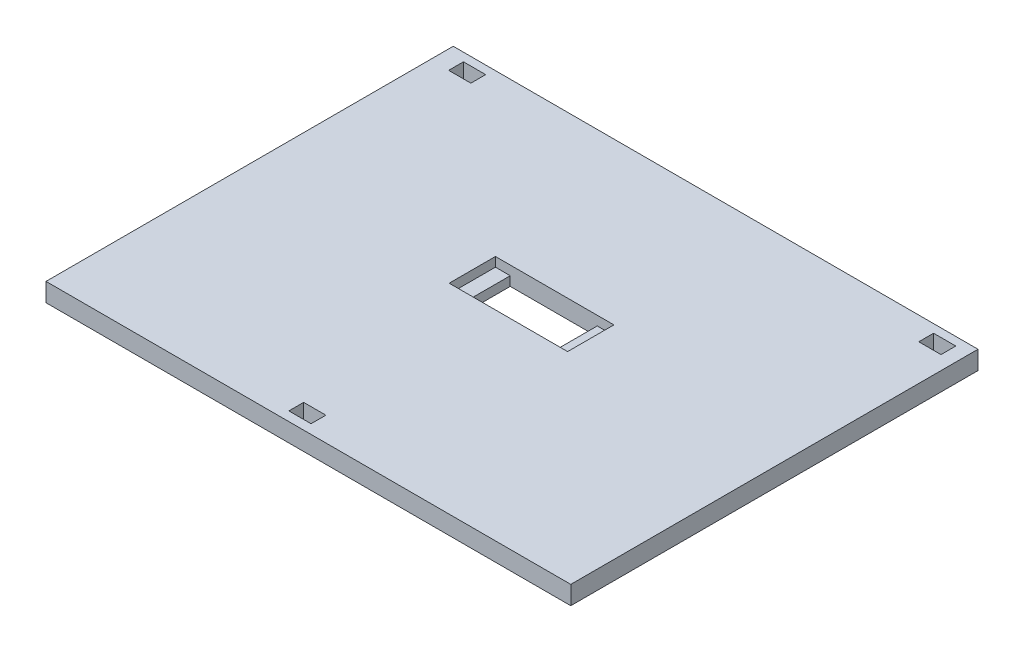
ISO-10303-21;
HEADER;
FILE_DESCRIPTION(('STEP AP214'),'2;1');
FILE_NAME('part.step','',(''),(''),'','','');
FILE_SCHEMA(('AUTOMOTIVE_DESIGN { 1 0 10303 214 1 1 1 1 }'));
ENDSEC;
DATA;
#1=APPLICATION_CONTEXT('core data for automotive mechanical design processes');
#2=APPLICATION_PROTOCOL_DEFINITION('international standard','automotive_design',2000,#1);
#3=PRODUCT_CONTEXT('',#1,'mechanical');
#4=PRODUCT('Part','Part','',(#3));
#5=PRODUCT_RELATED_PRODUCT_CATEGORY('part','',(#4));
#6=PRODUCT_DEFINITION_FORMATION('','',#4);
#7=PRODUCT_DEFINITION_CONTEXT('part definition',#1,'design');
#8=PRODUCT_DEFINITION('design','',#6,#7);
#9=PRODUCT_DEFINITION_SHAPE('','',#8);
#10=(LENGTH_UNIT() NAMED_UNIT(*) SI_UNIT(.MILLI.,.METRE.));
#11=(NAMED_UNIT(*) PLANE_ANGLE_UNIT() SI_UNIT($,.RADIAN.));
#12=(NAMED_UNIT(*) SI_UNIT($,.STERADIAN.) SOLID_ANGLE_UNIT());
#13=UNCERTAINTY_MEASURE_WITH_UNIT(LENGTH_MEASURE(1.E-05),#10,'distance_accuracy_value','');
#14=(GEOMETRIC_REPRESENTATION_CONTEXT(3) GLOBAL_UNCERTAINTY_ASSIGNED_CONTEXT((#13)) GLOBAL_UNIT_ASSIGNED_CONTEXT((#10,
#11,#12)) REPRESENTATION_CONTEXT('',''));
#15=CARTESIAN_POINT('',(0.,0.,0.));
#16=DIRECTION('',(0.,0.,1.));
#17=DIRECTION('',(1.,0.,0.));
#18=AXIS2_PLACEMENT_3D('',#15,#16,#17);
#19=CARTESIAN_POINT('',(0.,2.54,0.));
#20=DIRECTION('',(0.,1.,0.));
#21=DIRECTION('',(0.,0.,1.));
#22=AXIS2_PLACEMENT_3D('',#19,#20,#21);
#23=PLANE('',#22);
#24=DIRECTION('',(0.,0.,1.));
#25=VECTOR('',#24,1.);
#26=CARTESIAN_POINT('',(-22.8669688569918,2.54,8.40055247577288));
#27=LINE('',#26,#25);
#28=CARTESIAN_POINT('',(-22.8669688569918,2.54,8.40055247577288));
#29=VERTEX_POINT('',#28);
#30=CARTESIAN_POINT('',(-22.8669688569918,2.54,21.1005524757729));
#31=VERTEX_POINT('',#30);
#32=EDGE_CURVE('E213',#29,#31,#27,.T.);
#33=ORIENTED_EDGE('',*,*,#32,.F.);
#34=DIRECTION('',(-1.,0.,0.));
#35=VECTOR('',#34,1.);
#36=CARTESIAN_POINT('',(-26.9309688569918,2.54,8.40055247577288));
#37=LINE('',#36,#35);
#38=CARTESIAN_POINT('',(-26.9309688569918,2.54,8.40055247577288));
#39=VERTEX_POINT('',#38);
#40=EDGE_CURVE('E265',#29,#39,#37,.T.);
#41=ORIENTED_EDGE('',*,*,#40,.T.);
#42=DIRECTION('',(0.,0.,1.));
#43=VECTOR('',#42,1.);
#44=CARTESIAN_POINT('',(-26.9309688569918,2.54,8.40055247577288));
#45=LINE('',#44,#43);
#46=CARTESIAN_POINT('',(-26.9309688569918,2.54,21.1005524757729));
#47=VERTEX_POINT('',#46);
#48=EDGE_CURVE('E252',#39,#47,#45,.T.);
#49=ORIENTED_EDGE('',*,*,#48,.T.);
#50=DIRECTION('',(1.,0.,0.));
#51=VECTOR('',#50,1.);
#52=CARTESIAN_POINT('',(-26.9309688569918,2.54,21.1005524757729));
#53=LINE('',#52,#51);
#54=EDGE_CURVE('E258',#47,#31,#53,.T.);
#55=ORIENTED_EDGE('',*,*,#54,.T.);
#56=EDGE_LOOP('',(#33,#41,#49,#55));
#57=FACE_BOUND('',#56,.T.);
#58=ADVANCED_FACE('F45',(#57),#23,.T.);
#59=CARTESIAN_POINT('',(-82.6839688569918,5.08,-35.7689444314931));
#60=DIRECTION('',(1.,0.,0.));
#61=DIRECTION('',(0.,0.,-1.));
#62=AXIS2_PLACEMENT_3D('',#59,#60,#61);
#63=PLANE('',#62);
#64=DIRECTION('',(0.,0.,1.));
#65=VECTOR('',#64,1.);
#66=CARTESIAN_POINT('',(-82.6839688569918,0.,-35.7689444314931));
#67=LINE('',#66,#65);
#68=CARTESIAN_POINT('',(-82.6839688569918,0.,-35.7689444314931));
#69=VERTEX_POINT('',#68);
#70=CARTESIAN_POINT('',(-82.6839688569918,0.,75.9910555685069));
#71=VERTEX_POINT('',#70);
#72=EDGE_CURVE('E332',#69,#71,#67,.T.);
#73=ORIENTED_EDGE('',*,*,#72,.T.);
#74=DIRECTION('',(0.,-1.,0.));
#75=VECTOR('',#74,1.);
#76=CARTESIAN_POINT('',(-82.6839688569918,5.08,75.9910555685069));
#77=LINE('',#76,#75);
#78=CARTESIAN_POINT('',(-82.6839688569918,5.08,75.9910555685069));
#79=VERTEX_POINT('',#78);
#80=EDGE_CURVE('E11',#79,#71,#77,.T.);
#81=ORIENTED_EDGE('',*,*,#80,.F.);
#82=DIRECTION('',(0.,0.,1.));
#83=VECTOR('',#82,1.);
#84=CARTESIAN_POINT('',(-82.6839688569918,5.08,-35.7689444314931));
#85=LINE('',#84,#83);
#86=CARTESIAN_POINT('',(-82.6839688569918,5.08,-35.7689444314931));
#87=VERTEX_POINT('',#86);
#88=EDGE_CURVE('E428',#87,#79,#85,.T.);
#89=ORIENTED_EDGE('',*,*,#88,.F.);
#90=DIRECTION('',(0.,-1.,0.));
#91=VECTOR('',#90,1.);
#92=CARTESIAN_POINT('',(-82.6839688569918,5.08,-35.7689444314931));
#93=LINE('',#92,#91);
#94=EDGE_CURVE('E442',#87,#69,#93,.T.);
#95=ORIENTED_EDGE('',*,*,#94,.T.);
#96=EDGE_LOOP('',(#73,#81,#89,#95));
#97=FACE_BOUND('',#96,.T.);
#98=ADVANCED_FACE('F47',(#97),#63,.F.);
#99=CARTESIAN_POINT('',(-82.6839688569918,5.08,75.9910555685069));
#100=DIRECTION('',(0.,0.,-1.));
#101=DIRECTION('',(-1.,0.,0.));
#102=AXIS2_PLACEMENT_3D('',#99,#100,#101);
#103=PLANE('',#102);
#104=DIRECTION('',(1.,0.,0.));
#105=VECTOR('',#104,1.);
#106=CARTESIAN_POINT('',(-82.6839688569918,0.,75.9910555685069));
#107=LINE('',#106,#105);
#108=CARTESIAN_POINT('',(61.3340311430082,0.,75.9910555685069));
#109=VERTEX_POINT('',#108);
#110=EDGE_CURVE('E446',#71,#109,#107,.T.);
#111=ORIENTED_EDGE('',*,*,#110,.T.);
#112=DIRECTION('',(0.,-1.,0.));
#113=VECTOR('',#112,1.);
#114=CARTESIAN_POINT('',(61.3340311430082,5.08,75.9910555685069));
#115=LINE('',#114,#113);
#116=CARTESIAN_POINT('',(61.3340311430082,5.08,75.9910555685069));
#117=VERTEX_POINT('',#116);
#118=EDGE_CURVE('E54',#117,#109,#115,.T.);
#119=ORIENTED_EDGE('',*,*,#118,.F.);
#120=DIRECTION('',(1.,0.,0.));
#121=VECTOR('',#120,1.);
#122=CARTESIAN_POINT('',(-82.6839688569918,5.08,75.9910555685069));
#123=LINE('',#122,#121);
#124=EDGE_CURVE('E432',#79,#117,#123,.T.);
#125=ORIENTED_EDGE('',*,*,#124,.F.);
#126=ORIENTED_EDGE('',*,*,#80,.T.);
#127=EDGE_LOOP('',(#111,#119,#125,#126));
#128=FACE_BOUND('',#127,.T.);
#129=ADVANCED_FACE('F481',(#128),#103,.F.);
#130=CARTESIAN_POINT('',(61.3340311430082,5.08,-35.7689444314931));
#131=DIRECTION('',(-1.,0.,0.));
#132=DIRECTION('',(0.,0.,1.));
#133=AXIS2_PLACEMENT_3D('',#130,#131,#132);
#134=PLANE('',#133);
#135=DIRECTION('',(0.,0.,-1.));
#136=VECTOR('',#135,1.);
#137=CARTESIAN_POINT('',(61.3340311430082,0.,-35.7689444314931));
#138=LINE('',#137,#136);
#139=CARTESIAN_POINT('',(61.3340311430082,0.,-35.7689444314931));
#140=VERTEX_POINT('',#139);
#141=EDGE_CURVE('E449',#109,#140,#138,.T.);
#142=ORIENTED_EDGE('',*,*,#141,.T.);
#143=DIRECTION('',(0.,-1.,0.));
#144=VECTOR('',#143,1.);
#145=CARTESIAN_POINT('',(61.3340311430082,5.08,-35.7689444314931));
#146=LINE('',#145,#144);
#147=CARTESIAN_POINT('',(61.3340311430082,5.08,-35.7689444314931));
#148=VERTEX_POINT('',#147);
#149=EDGE_CURVE('E457',#148,#140,#146,.T.);
#150=ORIENTED_EDGE('',*,*,#149,.F.);
#151=DIRECTION('',(0.,0.,-1.));
#152=VECTOR('',#151,1.);
#153=CARTESIAN_POINT('',(61.3340311430082,5.08,-35.7689444314931));
#154=LINE('',#153,#152);
#155=EDGE_CURVE('E436',#117,#148,#154,.T.);
#156=ORIENTED_EDGE('',*,*,#155,.F.);
#157=ORIENTED_EDGE('',*,*,#118,.T.);
#158=EDGE_LOOP('',(#142,#150,#156,#157));
#159=FACE_BOUND('',#158,.T.);
#160=ADVANCED_FACE('F466',(#159),#134,.F.);
#161=CARTESIAN_POINT('',(-82.6839688569918,5.08,-35.7689444314931));
#162=DIRECTION('',(0.,0.,1.));
#163=DIRECTION('',(1.,0.,0.));
#164=AXIS2_PLACEMENT_3D('',#161,#162,#163);
#165=PLANE('',#164);
#166=DIRECTION('',(-1.,0.,0.));
#167=VECTOR('',#166,1.);
#168=CARTESIAN_POINT('',(-82.6839688569918,0.,-35.7689444314931));
#169=LINE('',#168,#167);
#170=EDGE_CURVE('E433',#140,#69,#169,.T.);
#171=ORIENTED_EDGE('',*,*,#170,.T.);
#172=ORIENTED_EDGE('',*,*,#94,.F.);
#173=DIRECTION('',(-1.,0.,0.));
#174=VECTOR('',#173,1.);
#175=CARTESIAN_POINT('',(-82.6839688569918,5.08,-35.7689444314931));
#176=LINE('',#175,#174);
#177=EDGE_CURVE('E439',#148,#87,#176,.T.);
#178=ORIENTED_EDGE('',*,*,#177,.F.);
#179=ORIENTED_EDGE('',*,*,#149,.T.);
#180=EDGE_LOOP('',(#171,#172,#178,#179));
#181=FACE_BOUND('',#180,.T.);
#182=ADVANCED_FACE('F474',(#181),#165,.F.);
#183=CARTESIAN_POINT('',(0.,5.08,0.));
#184=DIRECTION('',(0.,1.,0.));
#185=DIRECTION('',(0.,0.,1.));
#186=AXIS2_PLACEMENT_3D('',#183,#184,#185);
#187=PLANE('',#186);
#188=DIRECTION('',(0.,0.,1.));
#189=VECTOR('',#188,1.);
#190=CARTESIAN_POINT('',(-26.9309688569918,5.08,8.40055247577288));
#191=LINE('',#190,#189);
#192=CARTESIAN_POINT('',(-26.9309688569918,5.08,8.40055247577288));
#193=VERTEX_POINT('',#192);
#194=CARTESIAN_POINT('',(-26.9309688569918,5.08,21.1005524757729));
#195=VERTEX_POINT('',#194);
#196=EDGE_CURVE('E246',#193,#195,#191,.T.);
#197=ORIENTED_EDGE('',*,*,#196,.F.);
#198=DIRECTION('',(-1.,0.,0.));
#199=VECTOR('',#198,1.);
#200=CARTESIAN_POINT('',(-26.9309688569918,5.08,8.40055247577288));
#201=LINE('',#200,#199);
#202=CARTESIAN_POINT('',(5.58103114300822,5.08,8.40055247577288));
#203=VERTEX_POINT('',#202);
#204=EDGE_CURVE('E257',#203,#193,#201,.T.);
#205=ORIENTED_EDGE('',*,*,#204,.F.);
#206=DIRECTION('',(0.,0.,-1.));
#207=VECTOR('',#206,1.);
#208=CARTESIAN_POINT('',(5.58103114300822,5.08,8.40055247577288));
#209=LINE('',#208,#207);
#210=CARTESIAN_POINT('',(5.58103114300822,5.08,21.1005524757729));
#211=VERTEX_POINT('',#210);
#212=EDGE_CURVE('E276',#211,#203,#209,.T.);
#213=ORIENTED_EDGE('',*,*,#212,.F.);
#214=DIRECTION('',(1.,0.,0.));
#215=VECTOR('',#214,1.);
#216=CARTESIAN_POINT('',(-26.9309688569918,5.08,21.1005524757729));
#217=LINE('',#216,#215);
#218=EDGE_CURVE('E273',#195,#211,#217,.T.);
#219=ORIENTED_EDGE('',*,*,#218,.F.);
#220=EDGE_LOOP('',(#197,#205,#213,#219));
#221=FACE_BOUND('',#220,.T.);
#222=DIRECTION('',(0.,0.,1.));
#223=VECTOR('',#222,1.);
#224=CARTESIAN_POINT('',(-77.5921293869005,5.08,-33.4829444314931));
#225=LINE('',#224,#223);
#226=CARTESIAN_POINT('',(-77.5921293869005,5.08,-33.4829444314931));
#227=VERTEX_POINT('',#226);
#228=CARTESIAN_POINT('',(-77.5921293869005,5.08,-29.4189444314931));
#229=VERTEX_POINT('',#228);
#230=EDGE_CURVE('E314',#227,#229,#225,.T.);
#231=ORIENTED_EDGE('',*,*,#230,.F.);
#232=DIRECTION('',(-1.,0.,0.));
#233=VECTOR('',#232,1.);
#234=CARTESIAN_POINT('',(-77.5921293869005,5.08,-33.4829444314931));
#235=LINE('',#234,#233);
#236=CARTESIAN_POINT('',(-71.4961293869005,5.08,-33.4829444314931));
#237=VERTEX_POINT('',#236);
#238=EDGE_CURVE('E301',#237,#227,#235,.T.);
#239=ORIENTED_EDGE('',*,*,#238,.F.);
#240=DIRECTION('',(0.,0.,-1.));
#241=VECTOR('',#240,1.);
#242=CARTESIAN_POINT('',(-71.4961293869005,5.08,-33.4829444314931));
#243=LINE('',#242,#241);
#244=CARTESIAN_POINT('',(-71.4961293869005,5.08,-29.4189444314931));
#245=VERTEX_POINT('',#244);
#246=EDGE_CURVE('E322',#245,#237,#243,.T.);
#247=ORIENTED_EDGE('',*,*,#246,.F.);
#248=DIRECTION('',(1.,0.,0.));
#249=VECTOR('',#248,1.);
#250=CARTESIAN_POINT('',(-77.5921293869005,5.08,-29.4189444314931));
#251=LINE('',#250,#249);
#252=EDGE_CURVE('E317',#229,#245,#251,.T.);
#253=ORIENTED_EDGE('',*,*,#252,.F.);
#254=EDGE_LOOP('',(#231,#239,#247,#253));
#255=FACE_BOUND('',#254,.T.);
#256=DIRECTION('',(0.,0.,1.));
#257=VECTOR('',#256,1.);
#258=CARTESIAN_POINT('',(51.4280311430082,5.08,-33.4829444314931));
#259=LINE('',#258,#257);
#260=CARTESIAN_POINT('',(51.4280311430082,5.08,-33.4829444314931));
#261=VERTEX_POINT('',#260);
#262=CARTESIAN_POINT('',(51.4280311430082,5.08,-29.4189444314931));
#263=VERTEX_POINT('',#262);
#264=EDGE_CURVE('E318',#261,#263,#259,.T.);
#265=ORIENTED_EDGE('',*,*,#264,.F.);
#266=DIRECTION('',(-1.,0.,0.));
#267=VECTOR('',#266,1.);
#268=CARTESIAN_POINT('',(51.4280311430082,5.08,-33.4829444314931));
#269=LINE('',#268,#267);
#270=CARTESIAN_POINT('',(57.5240311430082,5.08,-33.4829444314931));
#271=VERTEX_POINT('',#270);
#272=EDGE_CURVE('E357',#271,#261,#269,.T.);
#273=ORIENTED_EDGE('',*,*,#272,.F.);
#274=DIRECTION('',(0.,0.,-1.));
#275=VECTOR('',#274,1.);
#276=CARTESIAN_POINT('',(57.5240311430082,5.08,-33.4829444314931));
#277=LINE('',#276,#275);
#278=CARTESIAN_POINT('',(57.5240311430082,5.08,-29.4189444314931));
#279=VERTEX_POINT('',#278);
#280=EDGE_CURVE('E361',#279,#271,#277,.T.);
#281=ORIENTED_EDGE('',*,*,#280,.F.);
#282=DIRECTION('',(1.,0.,0.));
#283=VECTOR('',#282,1.);
#284=CARTESIAN_POINT('',(51.4280311430082,5.08,-29.4189444314931));
#285=LINE('',#284,#283);
#286=EDGE_CURVE('E366',#263,#279,#285,.T.);
#287=ORIENTED_EDGE('',*,*,#286,.F.);
#288=EDGE_LOOP('',(#265,#273,#281,#287));
#289=FACE_BOUND('',#288,.T.);
#290=DIRECTION('',(0.,0.,1.));
#291=VECTOR('',#290,1.);
#292=CARTESIAN_POINT('',(-18.579427519708,5.08,69.3870555685069));
#293=LINE('',#292,#291);
#294=CARTESIAN_POINT('',(-18.579427519708,5.08,69.3870555685069));
#295=VERTEX_POINT('',#294);
#296=CARTESIAN_POINT('',(-18.579427519708,5.08,73.4510555685069));
#297=VERTEX_POINT('',#296);
#298=EDGE_CURVE('E356',#295,#297,#293,.T.);
#299=ORIENTED_EDGE('',*,*,#298,.F.);
#300=DIRECTION('',(-1.,0.,0.));
#301=VECTOR('',#300,1.);
#302=CARTESIAN_POINT('',(-18.579427519708,5.08,69.3870555685069));
#303=LINE('',#302,#301);
#304=CARTESIAN_POINT('',(-12.483427519708,5.08,69.3870555685069));
#305=VERTEX_POINT('',#304);
#306=EDGE_CURVE('E399',#305,#295,#303,.T.);
#307=ORIENTED_EDGE('',*,*,#306,.F.);
#308=DIRECTION('',(0.,0.,-1.));
#309=VECTOR('',#308,1.);
#310=CARTESIAN_POINT('',(-12.483427519708,5.08,69.3870555685069));
#311=LINE('',#310,#309);
#312=CARTESIAN_POINT('',(-12.483427519708,5.08,73.4510555685069));
#313=VERTEX_POINT('',#312);
#314=EDGE_CURVE('E403',#313,#305,#311,.T.);
#315=ORIENTED_EDGE('',*,*,#314,.F.);
#316=DIRECTION('',(1.,0.,0.));
#317=VECTOR('',#316,1.);
#318=CARTESIAN_POINT('',(-18.579427519708,5.08,73.4510555685069));
#319=LINE('',#318,#317);
#320=EDGE_CURVE('E408',#297,#313,#319,.T.);
#321=ORIENTED_EDGE('',*,*,#320,.F.);
#322=EDGE_LOOP('',(#299,#307,#315,#321));
#323=FACE_BOUND('',#322,.T.);
#324=ORIENTED_EDGE('',*,*,#88,.T.);
#325=ORIENTED_EDGE('',*,*,#124,.T.);
#326=ORIENTED_EDGE('',*,*,#155,.T.);
#327=ORIENTED_EDGE('',*,*,#177,.T.);
#328=EDGE_LOOP('',(#324,#325,#326,#327));
#329=FACE_BOUND('',#328,.T.);
#330=ADVANCED_FACE('F480',(#221,#255,#289,#323,#329),#187,.T.);
#331=CARTESIAN_POINT('',(0.,0.,0.));
#332=DIRECTION('',(0.,1.,0.));
#333=DIRECTION('',(0.,0.,1.));
#334=AXIS2_PLACEMENT_3D('',#331,#332,#333);
#335=PLANE('',#334);
#336=DIRECTION('',(-1.,0.,0.));
#337=VECTOR('',#336,1.);
#338=CARTESIAN_POINT('',(-22.8669688569918,0.,8.40055247577288));
#339=LINE('',#338,#337);
#340=CARTESIAN_POINT('',(1.00903114300822,0.,8.40055247577288));
#341=VERTEX_POINT('',#340);
#342=CARTESIAN_POINT('',(-22.8669688569918,0.,8.40055247577288));
#343=VERTEX_POINT('',#342);
#344=EDGE_CURVE('E218',#341,#343,#339,.T.);
#345=ORIENTED_EDGE('',*,*,#344,.T.);
#346=DIRECTION('',(0.,0.,1.));
#347=VECTOR('',#346,1.);
#348=CARTESIAN_POINT('',(-22.8669688569918,0.,8.40055247577288));
#349=LINE('',#348,#347);
#350=CARTESIAN_POINT('',(-22.8669688569918,0.,21.1005524757729));
#351=VERTEX_POINT('',#350);
#352=EDGE_CURVE('E210',#343,#351,#349,.T.);
#353=ORIENTED_EDGE('',*,*,#352,.T.);
#354=DIRECTION('',(1.,0.,0.));
#355=VECTOR('',#354,1.);
#356=CARTESIAN_POINT('',(-22.8669688569918,0.,21.1005524757729));
#357=LINE('',#356,#355);
#358=CARTESIAN_POINT('',(1.00903114300822,0.,21.1005524757729));
#359=VERTEX_POINT('',#358);
#360=EDGE_CURVE('E221',#351,#359,#357,.T.);
#361=ORIENTED_EDGE('',*,*,#360,.T.);
#362=DIRECTION('',(0.,0.,-1.));
#363=VECTOR('',#362,1.);
#364=CARTESIAN_POINT('',(1.00903114300822,0.,8.40055247577288));
#365=LINE('',#364,#363);
#366=EDGE_CURVE('E66',#359,#341,#365,.T.);
#367=ORIENTED_EDGE('',*,*,#366,.T.);
#368=EDGE_LOOP('',(#345,#353,#361,#367));
#369=FACE_BOUND('',#368,.T.);
#370=DIRECTION('',(-1.,0.,0.));
#371=VECTOR('',#370,1.);
#372=CARTESIAN_POINT('',(-77.5921293869005,0.,-33.4829444314931));
#373=LINE('',#372,#371);
#374=CARTESIAN_POINT('',(-71.4961293869005,0.,-33.4829444314931));
#375=VERTEX_POINT('',#374);
#376=CARTESIAN_POINT('',(-77.5921293869005,0.,-33.4829444314931));
#377=VERTEX_POINT('',#376);
#378=EDGE_CURVE('E309',#375,#377,#373,.T.);
#379=ORIENTED_EDGE('',*,*,#378,.T.);
#380=DIRECTION('',(0.,0.,1.));
#381=VECTOR('',#380,1.);
#382=CARTESIAN_POINT('',(-77.5921293869005,0.,-33.4829444314931));
#383=LINE('',#382,#381);
#384=CARTESIAN_POINT('',(-77.5921293869005,0.,-29.4189444314931));
#385=VERTEX_POINT('',#384);
#386=EDGE_CURVE('E296',#377,#385,#383,.T.);
#387=ORIENTED_EDGE('',*,*,#386,.T.);
#388=DIRECTION('',(1.,0.,0.));
#389=VECTOR('',#388,1.);
#390=CARTESIAN_POINT('',(-77.5921293869005,0.,-29.4189444314931));
#391=LINE('',#390,#389);
#392=CARTESIAN_POINT('',(-71.4961293869005,0.,-29.4189444314931));
#393=VERTEX_POINT('',#392);
#394=EDGE_CURVE('E300',#385,#393,#391,.T.);
#395=ORIENTED_EDGE('',*,*,#394,.T.);
#396=DIRECTION('',(0.,0.,-1.));
#397=VECTOR('',#396,1.);
#398=CARTESIAN_POINT('',(-71.4961293869005,0.,-33.4829444314931));
#399=LINE('',#398,#397);
#400=EDGE_CURVE('E305',#393,#375,#399,.T.);
#401=ORIENTED_EDGE('',*,*,#400,.T.);
#402=EDGE_LOOP('',(#379,#387,#395,#401));
#403=FACE_BOUND('',#402,.T.);
#404=DIRECTION('',(-1.,0.,0.));
#405=VECTOR('',#404,1.);
#406=CARTESIAN_POINT('',(51.4280311430082,0.,-33.4829444314931));
#407=LINE('',#406,#405);
#408=CARTESIAN_POINT('',(57.5240311430082,0.,-33.4829444314931));
#409=VERTEX_POINT('',#408);
#410=CARTESIAN_POINT('',(51.4280311430082,0.,-33.4829444314931));
#411=VERTEX_POINT('',#410);
#412=EDGE_CURVE('E346',#409,#411,#407,.T.);
#413=ORIENTED_EDGE('',*,*,#412,.T.);
#414=DIRECTION('',(0.,0.,1.));
#415=VECTOR('',#414,1.);
#416=CARTESIAN_POINT('',(51.4280311430082,0.,-33.4829444314931));
#417=LINE('',#416,#415);
#418=CARTESIAN_POINT('',(51.4280311430082,0.,-29.4189444314931));
#419=VERTEX_POINT('',#418);
#420=EDGE_CURVE('E362',#411,#419,#417,.T.);
#421=ORIENTED_EDGE('',*,*,#420,.T.);
#422=DIRECTION('',(1.,0.,0.));
#423=VECTOR('',#422,1.);
#424=CARTESIAN_POINT('',(51.4280311430082,0.,-29.4189444314931));
#425=LINE('',#424,#423);
#426=CARTESIAN_POINT('',(57.5240311430082,0.,-29.4189444314931));
#427=VERTEX_POINT('',#426);
#428=EDGE_CURVE('E379',#419,#427,#425,.T.);
#429=ORIENTED_EDGE('',*,*,#428,.T.);
#430=DIRECTION('',(0.,0.,-1.));
#431=VECTOR('',#430,1.);
#432=CARTESIAN_POINT('',(57.5240311430082,0.,-33.4829444314931));
#433=LINE('',#432,#431);
#434=EDGE_CURVE('E375',#427,#409,#433,.T.);
#435=ORIENTED_EDGE('',*,*,#434,.T.);
#436=EDGE_LOOP('',(#413,#421,#429,#435));
#437=FACE_BOUND('',#436,.T.);
#438=DIRECTION('',(-1.,0.,0.));
#439=VECTOR('',#438,1.);
#440=CARTESIAN_POINT('',(-18.579427519708,0.,69.3870555685069));
#441=LINE('',#440,#439);
#442=CARTESIAN_POINT('',(-12.483427519708,0.,69.3870555685069));
#443=VERTEX_POINT('',#442);
#444=CARTESIAN_POINT('',(-18.579427519708,0.,69.3870555685069));
#445=VERTEX_POINT('',#444);
#446=EDGE_CURVE('E390',#443,#445,#441,.T.);
#447=ORIENTED_EDGE('',*,*,#446,.T.);
#448=DIRECTION('',(0.,0.,1.));
#449=VECTOR('',#448,1.);
#450=CARTESIAN_POINT('',(-18.579427519708,0.,69.3870555685069));
#451=LINE('',#450,#449);
#452=CARTESIAN_POINT('',(-18.579427519708,0.,73.4510555685069));
#453=VERTEX_POINT('',#452);
#454=EDGE_CURVE('E404',#445,#453,#451,.T.);
#455=ORIENTED_EDGE('',*,*,#454,.T.);
#456=DIRECTION('',(1.,0.,0.));
#457=VECTOR('',#456,1.);
#458=CARTESIAN_POINT('',(-18.579427519708,0.,73.4510555685069));
#459=LINE('',#458,#457);
#460=CARTESIAN_POINT('',(-12.483427519708,0.,73.4510555685069));
#461=VERTEX_POINT('',#460);
#462=EDGE_CURVE('E421',#453,#461,#459,.T.);
#463=ORIENTED_EDGE('',*,*,#462,.T.);
#464=DIRECTION('',(0.,0.,-1.));
#465=VECTOR('',#464,1.);
#466=CARTESIAN_POINT('',(-12.483427519708,0.,69.3870555685069));
#467=LINE('',#466,#465);
#468=EDGE_CURVE('E417',#461,#443,#467,.T.);
#469=ORIENTED_EDGE('',*,*,#468,.T.);
#470=EDGE_LOOP('',(#447,#455,#463,#469));
#471=FACE_BOUND('',#470,.T.);
#472=ORIENTED_EDGE('',*,*,#72,.F.);
#473=ORIENTED_EDGE('',*,*,#170,.F.);
#474=ORIENTED_EDGE('',*,*,#141,.F.);
#475=ORIENTED_EDGE('',*,*,#110,.F.);
#476=EDGE_LOOP('',(#472,#473,#474,#475));
#477=FACE_BOUND('',#476,.T.);
#478=ADVANCED_FACE('F228',(#369,#403,#437,#471,#477),#335,.F.);
#479=CARTESIAN_POINT('',(-18.579427519708,0.,69.3870555685069));
#480=DIRECTION('',(-1.,0.,0.));
#481=DIRECTION('',(0.,0.,1.));
#482=AXIS2_PLACEMENT_3D('',#479,#480,#481);
#483=PLANE('',#482);
#484=ORIENTED_EDGE('',*,*,#298,.T.);
#485=DIRECTION('',(0.,1.,0.));
#486=VECTOR('',#485,1.);
#487=CARTESIAN_POINT('',(-18.579427519708,0.,73.4510555685069));
#488=LINE('',#487,#486);
#489=EDGE_CURVE('E386',#453,#297,#488,.T.);
#490=ORIENTED_EDGE('',*,*,#489,.F.);
#491=ORIENTED_EDGE('',*,*,#454,.F.);
#492=DIRECTION('',(0.,1.,0.));
#493=VECTOR('',#492,1.);
#494=CARTESIAN_POINT('',(-18.579427519708,0.,69.3870555685069));
#495=LINE('',#494,#493);
#496=EDGE_CURVE('E286',#445,#295,#495,.T.);
#497=ORIENTED_EDGE('',*,*,#496,.T.);
#498=EDGE_LOOP('',(#484,#490,#491,#497));
#499=FACE_BOUND('',#498,.T.);
#500=ADVANCED_FACE('F675',(#499),#483,.F.);
#501=CARTESIAN_POINT('',(-18.579427519708,0.,69.3870555685069));
#502=DIRECTION('',(0.,0.,-1.));
#503=DIRECTION('',(-1.,0.,0.));
#504=AXIS2_PLACEMENT_3D('',#501,#502,#503);
#505=PLANE('',#504);
#506=ORIENTED_EDGE('',*,*,#306,.T.);
#507=ORIENTED_EDGE('',*,*,#496,.F.);
#508=ORIENTED_EDGE('',*,*,#446,.F.);
#509=DIRECTION('',(0.,1.,0.));
#510=VECTOR('',#509,1.);
#511=CARTESIAN_POINT('',(-12.483427519708,0.,69.3870555685069));
#512=LINE('',#511,#510);
#513=EDGE_CURVE('E394',#443,#305,#512,.T.);
#514=ORIENTED_EDGE('',*,*,#513,.T.);
#515=EDGE_LOOP('',(#506,#507,#508,#514));
#516=FACE_BOUND('',#515,.T.);
#517=ADVANCED_FACE('F666',(#516),#505,.F.);
#518=CARTESIAN_POINT('',(-12.483427519708,0.,69.3870555685069));
#519=DIRECTION('',(1.,0.,0.));
#520=DIRECTION('',(0.,0.,-1.));
#521=AXIS2_PLACEMENT_3D('',#518,#519,#520);
#522=PLANE('',#521);
#523=ORIENTED_EDGE('',*,*,#314,.T.);
#524=ORIENTED_EDGE('',*,*,#513,.F.);
#525=ORIENTED_EDGE('',*,*,#468,.F.);
#526=DIRECTION('',(0.,1.,0.));
#527=VECTOR('',#526,1.);
#528=CARTESIAN_POINT('',(-12.483427519708,0.,73.4510555685069));
#529=LINE('',#528,#527);
#530=EDGE_CURVE('E391',#461,#313,#529,.T.);
#531=ORIENTED_EDGE('',*,*,#530,.T.);
#532=EDGE_LOOP('',(#523,#524,#525,#531));
#533=FACE_BOUND('',#532,.T.);
#534=ADVANCED_FACE('F657',(#533),#522,.F.);
#535=CARTESIAN_POINT('',(-18.579427519708,0.,73.4510555685069));
#536=DIRECTION('',(0.,0.,1.));
#537=DIRECTION('',(1.,0.,0.));
#538=AXIS2_PLACEMENT_3D('',#535,#536,#537);
#539=PLANE('',#538);
#540=ORIENTED_EDGE('',*,*,#320,.T.);
#541=ORIENTED_EDGE('',*,*,#530,.F.);
#542=ORIENTED_EDGE('',*,*,#462,.F.);
#543=ORIENTED_EDGE('',*,*,#489,.T.);
#544=EDGE_LOOP('',(#540,#541,#542,#543));
#545=FACE_BOUND('',#544,.T.);
#546=ADVANCED_FACE('F648',(#545),#539,.F.);
#547=CARTESIAN_POINT('',(51.4280311430082,0.,-33.4829444314931));
#548=DIRECTION('',(-1.,0.,0.));
#549=DIRECTION('',(0.,0.,1.));
#550=AXIS2_PLACEMENT_3D('',#547,#548,#549);
#551=PLANE('',#550);
#552=ORIENTED_EDGE('',*,*,#264,.T.);
#553=DIRECTION('',(0.,1.,0.));
#554=VECTOR('',#553,1.);
#555=CARTESIAN_POINT('',(51.4280311430082,0.,-29.4189444314931));
#556=LINE('',#555,#554);
#557=EDGE_CURVE('E342',#419,#263,#556,.T.);
#558=ORIENTED_EDGE('',*,*,#557,.F.);
#559=ORIENTED_EDGE('',*,*,#420,.F.);
#560=DIRECTION('',(0.,1.,0.));
#561=VECTOR('',#560,1.);
#562=CARTESIAN_POINT('',(51.4280311430082,0.,-33.4829444314931));
#563=LINE('',#562,#561);
#564=EDGE_CURVE('E353',#411,#261,#563,.T.);
#565=ORIENTED_EDGE('',*,*,#564,.T.);
#566=EDGE_LOOP('',(#552,#558,#559,#565));
#567=FACE_BOUND('',#566,.T.);
#568=ADVANCED_FACE('F639',(#567),#551,.F.);
#569=CARTESIAN_POINT('',(51.4280311430082,0.,-33.4829444314931));
#570=DIRECTION('',(0.,0.,-1.));
#571=DIRECTION('',(-1.,0.,0.));
#572=AXIS2_PLACEMENT_3D('',#569,#570,#571);
#573=PLANE('',#572);
#574=ORIENTED_EDGE('',*,*,#272,.T.);
#575=ORIENTED_EDGE('',*,*,#564,.F.);
#576=ORIENTED_EDGE('',*,*,#412,.F.);
#577=DIRECTION('',(0.,1.,0.));
#578=VECTOR('',#577,1.);
#579=CARTESIAN_POINT('',(57.5240311430082,0.,-33.4829444314931));
#580=LINE('',#579,#578);
#581=EDGE_CURVE('E350',#409,#271,#580,.T.);
#582=ORIENTED_EDGE('',*,*,#581,.T.);
#583=EDGE_LOOP('',(#574,#575,#576,#582));
#584=FACE_BOUND('',#583,.T.);
#585=ADVANCED_FACE('F630',(#584),#573,.F.);
#586=CARTESIAN_POINT('',(57.5240311430082,0.,-33.4829444314931));
#587=DIRECTION('',(1.,0.,0.));
#588=DIRECTION('',(0.,0.,-1.));
#589=AXIS2_PLACEMENT_3D('',#586,#587,#588);
#590=PLANE('',#589);
#591=ORIENTED_EDGE('',*,*,#280,.T.);
#592=ORIENTED_EDGE('',*,*,#581,.F.);
#593=ORIENTED_EDGE('',*,*,#434,.F.);
#594=DIRECTION('',(0.,1.,0.));
#595=VECTOR('',#594,1.);
#596=CARTESIAN_POINT('',(57.5240311430082,0.,-29.4189444314931));
#597=LINE('',#596,#595);
#598=EDGE_CURVE('E347',#427,#279,#597,.T.);
#599=ORIENTED_EDGE('',*,*,#598,.T.);
#600=EDGE_LOOP('',(#591,#592,#593,#599));
#601=FACE_BOUND('',#600,.T.);
#602=ADVANCED_FACE('F621',(#601),#590,.F.);
#603=CARTESIAN_POINT('',(51.4280311430082,0.,-29.4189444314931));
#604=DIRECTION('',(0.,0.,1.));
#605=DIRECTION('',(1.,0.,0.));
#606=AXIS2_PLACEMENT_3D('',#603,#604,#605);
#607=PLANE('',#606);
#608=ORIENTED_EDGE('',*,*,#286,.T.);
#609=ORIENTED_EDGE('',*,*,#598,.F.);
#610=ORIENTED_EDGE('',*,*,#428,.F.);
#611=ORIENTED_EDGE('',*,*,#557,.T.);
#612=EDGE_LOOP('',(#608,#609,#610,#611));
#613=FACE_BOUND('',#612,.T.);
#614=ADVANCED_FACE('F612',(#613),#607,.F.);
#615=CARTESIAN_POINT('',(-77.5921293869005,0.,-33.4829444314931));
#616=DIRECTION('',(-1.,0.,0.));
#617=DIRECTION('',(0.,0.,1.));
#618=AXIS2_PLACEMENT_3D('',#615,#616,#617);
#619=PLANE('',#618);
#620=ORIENTED_EDGE('',*,*,#230,.T.);
#621=DIRECTION('',(0.,1.,0.));
#622=VECTOR('',#621,1.);
#623=CARTESIAN_POINT('',(-77.5921293869005,0.,-29.4189444314931));
#624=LINE('',#623,#622);
#625=EDGE_CURVE('E313',#385,#229,#624,.T.);
#626=ORIENTED_EDGE('',*,*,#625,.F.);
#627=ORIENTED_EDGE('',*,*,#386,.F.);
#628=DIRECTION('',(0.,1.,0.));
#629=VECTOR('',#628,1.);
#630=CARTESIAN_POINT('',(-77.5921293869005,0.,-33.4829444314931));
#631=LINE('',#630,#629);
#632=EDGE_CURVE('E329',#377,#227,#631,.T.);
#633=ORIENTED_EDGE('',*,*,#632,.T.);
#634=EDGE_LOOP('',(#620,#626,#627,#633));
#635=FACE_BOUND('',#634,.T.);
#636=ADVANCED_FACE('F603',(#635),#619,.F.);
#637=CARTESIAN_POINT('',(-77.5921293869005,0.,-33.4829444314931));
#638=DIRECTION('',(0.,0.,-1.));
#639=DIRECTION('',(-1.,0.,0.));
#640=AXIS2_PLACEMENT_3D('',#637,#638,#639);
#641=PLANE('',#640);
#642=ORIENTED_EDGE('',*,*,#238,.T.);
#643=ORIENTED_EDGE('',*,*,#632,.F.);
#644=ORIENTED_EDGE('',*,*,#378,.F.);
#645=DIRECTION('',(0.,1.,0.));
#646=VECTOR('',#645,1.);
#647=CARTESIAN_POINT('',(-71.4961293869005,0.,-33.4829444314931));
#648=LINE('',#647,#646);
#649=EDGE_CURVE('E333',#375,#237,#648,.T.);
#650=ORIENTED_EDGE('',*,*,#649,.T.);
#651=EDGE_LOOP('',(#642,#643,#644,#650));
#652=FACE_BOUND('',#651,.T.);
#653=ADVANCED_FACE('F594',(#652),#641,.F.);
#654=CARTESIAN_POINT('',(-71.4961293869005,0.,-33.4829444314931));
#655=DIRECTION('',(1.,0.,0.));
#656=DIRECTION('',(0.,0.,-1.));
#657=AXIS2_PLACEMENT_3D('',#654,#655,#656);
#658=PLANE('',#657);
#659=ORIENTED_EDGE('',*,*,#246,.T.);
#660=ORIENTED_EDGE('',*,*,#649,.F.);
#661=ORIENTED_EDGE('',*,*,#400,.F.);
#662=DIRECTION('',(0.,1.,0.));
#663=VECTOR('',#662,1.);
#664=CARTESIAN_POINT('',(-71.4961293869005,0.,-29.4189444314931));
#665=LINE('',#664,#663);
#666=EDGE_CURVE('E336',#393,#245,#665,.T.);
#667=ORIENTED_EDGE('',*,*,#666,.T.);
#668=EDGE_LOOP('',(#659,#660,#661,#667));
#669=FACE_BOUND('',#668,.T.);
#670=ADVANCED_FACE('F585',(#669),#658,.F.);
#671=CARTESIAN_POINT('',(-77.5921293869005,0.,-29.4189444314931));
#672=DIRECTION('',(0.,0.,1.));
#673=DIRECTION('',(1.,0.,0.));
#674=AXIS2_PLACEMENT_3D('',#671,#672,#673);
#675=PLANE('',#674);
#676=ORIENTED_EDGE('',*,*,#252,.T.);
#677=ORIENTED_EDGE('',*,*,#666,.F.);
#678=ORIENTED_EDGE('',*,*,#394,.F.);
#679=ORIENTED_EDGE('',*,*,#625,.T.);
#680=EDGE_LOOP('',(#676,#677,#678,#679));
#681=FACE_BOUND('',#680,.T.);
#682=ADVANCED_FACE('F577',(#681),#675,.F.);
#683=CARTESIAN_POINT('',(-26.9309688569918,2.54,8.40055247577288));
#684=DIRECTION('',(-1.,0.,0.));
#685=DIRECTION('',(0.,0.,1.));
#686=AXIS2_PLACEMENT_3D('',#683,#684,#685);
#687=PLANE('',#686);
#688=ORIENTED_EDGE('',*,*,#196,.T.);
#689=DIRECTION('',(0.,1.,0.));
#690=VECTOR('',#689,1.);
#691=CARTESIAN_POINT('',(-26.9309688569918,2.54,21.1005524757729));
#692=LINE('',#691,#690);
#693=EDGE_CURVE('E270',#47,#195,#692,.T.);
#694=ORIENTED_EDGE('',*,*,#693,.F.);
#695=ORIENTED_EDGE('',*,*,#48,.F.);
#696=DIRECTION('',(0.,1.,0.));
#697=VECTOR('',#696,1.);
#698=CARTESIAN_POINT('',(-26.9309688569918,2.54,8.40055247577288));
#699=LINE('',#698,#697);
#700=EDGE_CURVE('E283',#39,#193,#699,.T.);
#701=ORIENTED_EDGE('',*,*,#700,.T.);
#702=EDGE_LOOP('',(#688,#694,#695,#701));
#703=FACE_BOUND('',#702,.T.);
#704=ADVANCED_FACE('F520',(#703),#687,.F.);
#705=CARTESIAN_POINT('',(-26.9309688569918,2.54,8.40055247577288));
#706=DIRECTION('',(0.,0.,-1.));
#707=DIRECTION('',(-1.,0.,0.));
#708=AXIS2_PLACEMENT_3D('',#705,#706,#707);
#709=PLANE('',#708);
#710=ORIENTED_EDGE('',*,*,#204,.T.);
#711=ORIENTED_EDGE('',*,*,#700,.F.);
#712=ORIENTED_EDGE('',*,*,#40,.F.);
#713=DIRECTION('',(0.,1.,0.));
#714=VECTOR('',#713,1.);
#715=CARTESIAN_POINT('',(-22.8669688569918,0.,8.40055247577288));
#716=LINE('',#715,#714);
#717=EDGE_CURVE('E243',#343,#29,#716,.T.);
#718=ORIENTED_EDGE('',*,*,#717,.F.);
#719=ORIENTED_EDGE('',*,*,#344,.F.);
#720=DIRECTION('',(0.,1.,0.));
#721=VECTOR('',#720,1.);
#722=CARTESIAN_POINT('',(1.00903114300822,0.,8.40055247577288));
#723=LINE('',#722,#721);
#724=CARTESIAN_POINT('',(1.00903114300822,2.54,8.40055247577288));
#725=VERTEX_POINT('',#724);
#726=EDGE_CURVE('E247',#341,#725,#723,.T.);
#727=ORIENTED_EDGE('',*,*,#726,.T.);
#728=CARTESIAN_POINT('',(5.58103114300822,2.54,8.40055247577288));
#729=VERTEX_POINT('',#728);
#730=EDGE_CURVE('E266',#729,#725,#37,.T.);
#731=ORIENTED_EDGE('',*,*,#730,.F.);
#732=DIRECTION('',(0.,1.,0.));
#733=VECTOR('',#732,1.);
#734=CARTESIAN_POINT('',(5.58103114300822,2.54,8.40055247577288));
#735=LINE('',#734,#733);
#736=EDGE_CURVE('E287',#729,#203,#735,.T.);
#737=ORIENTED_EDGE('',*,*,#736,.T.);
#738=EDGE_LOOP('',(#710,#711,#712,#718,#719,#727,#731,#737));
#739=FACE_BOUND('',#738,.T.);
#740=ADVANCED_FACE('F516',(#739),#709,.F.);
#741=CARTESIAN_POINT('',(5.58103114300822,2.54,8.40055247577288));
#742=DIRECTION('',(1.,0.,0.));
#743=DIRECTION('',(0.,0.,-1.));
#744=AXIS2_PLACEMENT_3D('',#741,#742,#743);
#745=PLANE('',#744);
#746=ORIENTED_EDGE('',*,*,#212,.T.);
#747=ORIENTED_EDGE('',*,*,#736,.F.);
#748=DIRECTION('',(0.,0.,-1.));
#749=VECTOR('',#748,1.);
#750=CARTESIAN_POINT('',(5.58103114300822,2.54,8.40055247577288));
#751=LINE('',#750,#749);
#752=CARTESIAN_POINT('',(5.58103114300822,2.54,21.1005524757729));
#753=VERTEX_POINT('',#752);
#754=EDGE_CURVE('E261',#753,#729,#751,.T.);
#755=ORIENTED_EDGE('',*,*,#754,.F.);
#756=DIRECTION('',(0.,1.,0.));
#757=VECTOR('',#756,1.);
#758=CARTESIAN_POINT('',(5.58103114300822,2.54,21.1005524757729));
#759=LINE('',#758,#757);
#760=EDGE_CURVE('E290',#753,#211,#759,.T.);
#761=ORIENTED_EDGE('',*,*,#760,.T.);
#762=EDGE_LOOP('',(#746,#747,#755,#761));
#763=FACE_BOUND('',#762,.T.);
#764=ADVANCED_FACE('F505',(#763),#745,.F.);
#765=CARTESIAN_POINT('',(-26.9309688569918,2.54,21.1005524757729));
#766=DIRECTION('',(0.,0.,1.));
#767=DIRECTION('',(1.,0.,0.));
#768=AXIS2_PLACEMENT_3D('',#765,#766,#767);
#769=PLANE('',#768);
#770=ORIENTED_EDGE('',*,*,#218,.T.);
#771=ORIENTED_EDGE('',*,*,#760,.F.);
#772=CARTESIAN_POINT('',(1.00903114300822,2.54,21.1005524757729));
#773=VERTEX_POINT('',#772);
#774=EDGE_CURVE('E256',#773,#753,#53,.T.);
#775=ORIENTED_EDGE('',*,*,#774,.F.);
#776=DIRECTION('',(0.,1.,0.));
#777=VECTOR('',#776,1.);
#778=CARTESIAN_POINT('',(1.00903114300822,0.,21.1005524757729));
#779=LINE('',#778,#777);
#780=EDGE_CURVE('E61',#359,#773,#779,.T.);
#781=ORIENTED_EDGE('',*,*,#780,.F.);
#782=ORIENTED_EDGE('',*,*,#360,.F.);
#783=DIRECTION('',(0.,1.,0.));
#784=VECTOR('',#783,1.);
#785=CARTESIAN_POINT('',(-22.8669688569918,0.,21.1005524757729));
#786=LINE('',#785,#784);
#787=EDGE_CURVE('E206',#351,#31,#786,.T.);
#788=ORIENTED_EDGE('',*,*,#787,.T.);
#789=ORIENTED_EDGE('',*,*,#54,.F.);
#790=ORIENTED_EDGE('',*,*,#693,.T.);
#791=EDGE_LOOP('',(#770,#771,#775,#781,#782,#788,#789,#790));
#792=FACE_BOUND('',#791,.T.);
#793=ADVANCED_FACE('F223',(#792),#769,.F.);
#794=DIRECTION('',(0.,0.,-1.));
#795=VECTOR('',#794,1.);
#796=CARTESIAN_POINT('',(1.00903114300822,2.54,8.40055247577288));
#797=LINE('',#796,#795);
#798=EDGE_CURVE('E232',#773,#725,#797,.T.);
#799=ORIENTED_EDGE('',*,*,#798,.F.);
#800=ORIENTED_EDGE('',*,*,#774,.T.);
#801=ORIENTED_EDGE('',*,*,#754,.T.);
#802=ORIENTED_EDGE('',*,*,#730,.T.);
#803=EDGE_LOOP('',(#799,#800,#801,#802));
#804=FACE_BOUND('',#803,.T.);
#805=ADVANCED_FACE('F491',(#804),#23,.T.);
#806=CARTESIAN_POINT('',(-22.8669688569918,0.,8.40055247577288));
#807=DIRECTION('',(-1.,0.,0.));
#808=DIRECTION('',(0.,0.,1.));
#809=AXIS2_PLACEMENT_3D('',#806,#807,#808);
#810=PLANE('',#809);
#811=ORIENTED_EDGE('',*,*,#32,.T.);
#812=ORIENTED_EDGE('',*,*,#787,.F.);
#813=ORIENTED_EDGE('',*,*,#352,.F.);
#814=ORIENTED_EDGE('',*,*,#717,.T.);
#815=EDGE_LOOP('',(#811,#812,#813,#814));
#816=FACE_BOUND('',#815,.T.);
#817=ADVANCED_FACE('F208',(#816),#810,.F.);
#818=CARTESIAN_POINT('',(1.00903114300822,0.,8.40055247577288));
#819=DIRECTION('',(1.,0.,0.));
#820=DIRECTION('',(0.,0.,-1.));
#821=AXIS2_PLACEMENT_3D('',#818,#819,#820);
#822=PLANE('',#821);
#823=ORIENTED_EDGE('',*,*,#798,.T.);
#824=ORIENTED_EDGE('',*,*,#726,.F.);
#825=ORIENTED_EDGE('',*,*,#366,.F.);
#826=ORIENTED_EDGE('',*,*,#780,.T.);
#827=EDGE_LOOP('',(#823,#824,#825,#826));
#828=FACE_BOUND('',#827,.T.);
#829=ADVANCED_FACE('F504',(#828),#822,.F.);
#830=CLOSED_SHELL('',(#58,#98,#129,#160,#182,#330,#478,#500,#517,#534,#546,#568,#585,#602,#614,
#636,#653,#670,#682,#704,#740,#764,#793,#805,#817,#829));
#831=MANIFOLD_SOLID_BREP('B2',#830);
#832=ADVANCED_BREP_SHAPE_REPRESENTATION('',(#18,#831),#14);
#833=SHAPE_DEFINITION_REPRESENTATION(#9,#832);
ENDSEC;
END-ISO-10303-21;
